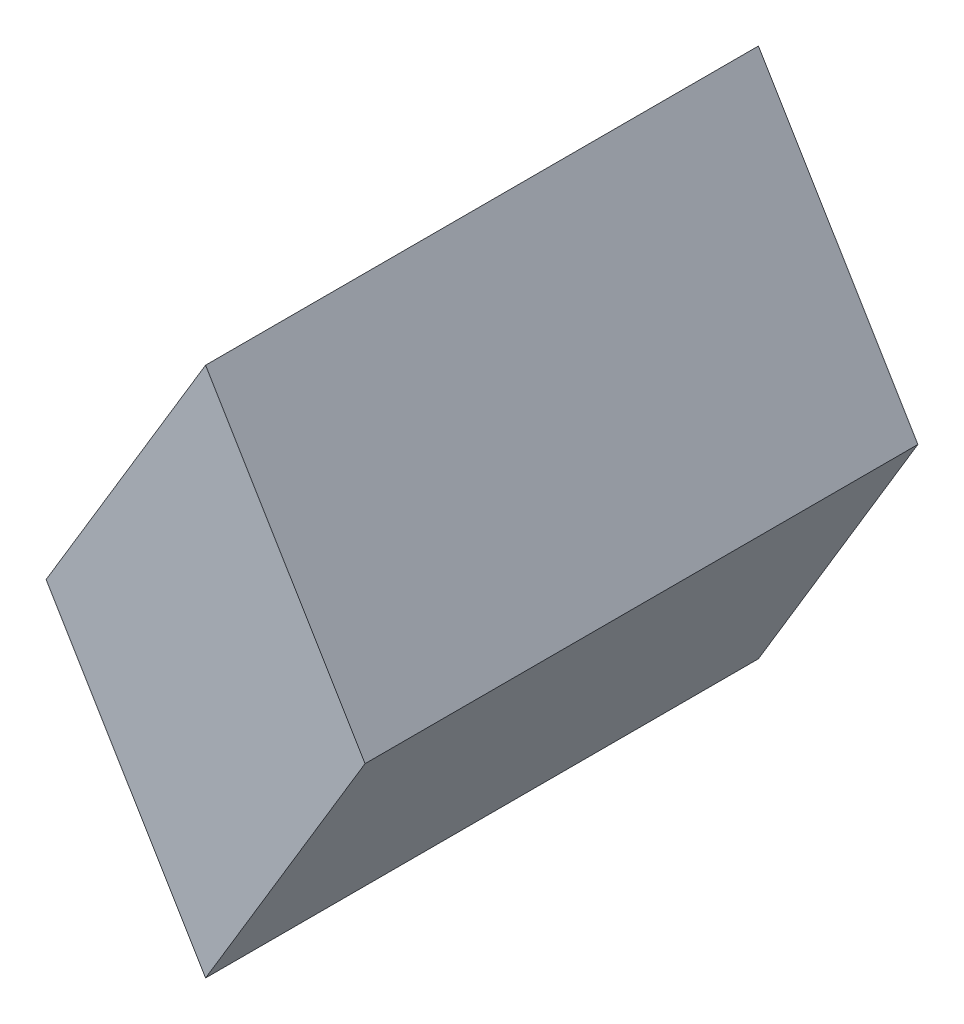
ISO-10303-21;
HEADER;
FILE_DESCRIPTION(('STEP AP214'),'2;1');
FILE_NAME('part.step','',(''),(''),'','','');
FILE_SCHEMA(('AUTOMOTIVE_DESIGN { 1 0 10303 214 1 1 1 1 }'));
ENDSEC;
DATA;
#1=APPLICATION_CONTEXT('core data for automotive mechanical design processes');
#2=APPLICATION_PROTOCOL_DEFINITION('international standard','automotive_design',2000,#1);
#3=PRODUCT_CONTEXT('',#1,'mechanical');
#4=PRODUCT('Part','Part','',(#3));
#5=PRODUCT_RELATED_PRODUCT_CATEGORY('part','',(#4));
#6=PRODUCT_DEFINITION_FORMATION('','',#4);
#7=PRODUCT_DEFINITION_CONTEXT('part definition',#1,'design');
#8=PRODUCT_DEFINITION('design','',#6,#7);
#9=PRODUCT_DEFINITION_SHAPE('','',#8);
#10=(LENGTH_UNIT() NAMED_UNIT(*) SI_UNIT(.MILLI.,.METRE.));
#11=(NAMED_UNIT(*) PLANE_ANGLE_UNIT() SI_UNIT($,.RADIAN.));
#12=(NAMED_UNIT(*) SI_UNIT($,.STERADIAN.) SOLID_ANGLE_UNIT());
#13=UNCERTAINTY_MEASURE_WITH_UNIT(LENGTH_MEASURE(1.E-05),#10,'distance_accuracy_value','');
#14=(GEOMETRIC_REPRESENTATION_CONTEXT(3) GLOBAL_UNCERTAINTY_ASSIGNED_CONTEXT((#13)) GLOBAL_UNIT_ASSIGNED_CONTEXT((#10,
#11,#12)) REPRESENTATION_CONTEXT('',''));
#15=CARTESIAN_POINT('',(0.,0.,0.));
#16=DIRECTION('',(0.,0.,1.));
#17=DIRECTION('',(1.,0.,0.));
#18=AXIS2_PLACEMENT_3D('',#15,#16,#17);
#19=CARTESIAN_POINT('',(-14.422205101856,0.535031847133759,50.));
#20=DIRECTION('',(0.857142857142857,-0.515078753637713,0.));
#21=DIRECTION('',(0.515078753637713,0.857142857142857,0.));
#22=AXIS2_PLACEMENT_3D('',#19,#20,#21);
#23=PLANE('',#22);
#24=DIRECTION('',(-0.515078753637713,-0.857142857142857,0.));
#25=VECTOR('',#24,1.);
#26=CARTESIAN_POINT('',(-14.422205101856,0.535031847133759,0.));
#27=LINE('',#26,#25);
#28=CARTESIAN_POINT('',(0.,24.5350318471338,0.));
#29=VERTEX_POINT('',#28);
#30=CARTESIAN_POINT('',(-14.422205101856,0.535031847133759,0.));
#31=VERTEX_POINT('',#30);
#32=EDGE_CURVE('E96',#29,#31,#27,.T.);
#33=ORIENTED_EDGE('',*,*,#32,.T.);
#34=DIRECTION('',(0.,0.,-1.));
#35=VECTOR('',#34,1.);
#36=CARTESIAN_POINT('',(-14.422205101856,0.535031847133759,50.));
#37=LINE('',#36,#35);
#38=CARTESIAN_POINT('',(-14.422205101856,0.535031847133759,50.));
#39=VERTEX_POINT('',#38);
#40=EDGE_CURVE('E11',#39,#31,#37,.T.);
#41=ORIENTED_EDGE('',*,*,#40,.F.);
#42=DIRECTION('',(-0.515078753637713,-0.857142857142857,0.));
#43=VECTOR('',#42,1.);
#44=CARTESIAN_POINT('',(-14.422205101856,0.535031847133759,50.));
#45=LINE('',#44,#43);
#46=CARTESIAN_POINT('',(0.,24.5350318471338,50.));
#47=VERTEX_POINT('',#46);
#48=EDGE_CURVE('E84',#47,#39,#45,.T.);
#49=ORIENTED_EDGE('',*,*,#48,.F.);
#50=DIRECTION('',(0.,0.,-1.));
#51=VECTOR('',#50,1.);
#52=CARTESIAN_POINT('',(0.,24.5350318471338,50.));
#53=LINE('',#52,#51);
#54=EDGE_CURVE('E92',#47,#29,#53,.T.);
#55=ORIENTED_EDGE('',*,*,#54,.T.);
#56=EDGE_LOOP('',(#33,#41,#49,#55));
#57=FACE_BOUND('',#56,.T.);
#58=ADVANCED_FACE('F33',(#57),#23,.F.);
#59=CARTESIAN_POINT('',(0.,-23.4649681528662,50.));
#60=DIRECTION('',(0.857142857142857,0.515078753637713,0.));
#61=DIRECTION('',(-0.515078753637713,0.857142857142857,0.));
#62=AXIS2_PLACEMENT_3D('',#59,#60,#61);
#63=PLANE('',#62);
#64=DIRECTION('',(0.515078753637713,-0.857142857142857,0.));
#65=VECTOR('',#64,1.);
#66=CARTESIAN_POINT('',(0.,-23.4649681528662,0.));
#67=LINE('',#66,#65);
#68=CARTESIAN_POINT('',(0.,-23.4649681528662,0.));
#69=VERTEX_POINT('',#68);
#70=EDGE_CURVE('E88',#31,#69,#67,.T.);
#71=ORIENTED_EDGE('',*,*,#70,.T.);
#72=DIRECTION('',(0.,0.,-1.));
#73=VECTOR('',#72,1.);
#74=CARTESIAN_POINT('',(0.,-23.4649681528662,50.));
#75=LINE('',#74,#73);
#76=CARTESIAN_POINT('',(0.,-23.4649681528662,50.));
#77=VERTEX_POINT('',#76);
#78=EDGE_CURVE('E41',#77,#69,#75,.T.);
#79=ORIENTED_EDGE('',*,*,#78,.F.);
#80=DIRECTION('',(0.515078753637713,-0.857142857142857,0.));
#81=VECTOR('',#80,1.);
#82=CARTESIAN_POINT('',(0.,-23.4649681528662,50.));
#83=LINE('',#82,#81);
#84=EDGE_CURVE('E79',#39,#77,#83,.T.);
#85=ORIENTED_EDGE('',*,*,#84,.F.);
#86=ORIENTED_EDGE('',*,*,#40,.T.);
#87=EDGE_LOOP('',(#71,#79,#85,#86));
#88=FACE_BOUND('',#87,.T.);
#89=ADVANCED_FACE('F87',(#88),#63,.F.);
#90=CARTESIAN_POINT('',(14.422205101856,0.535031847133759,50.));
#91=DIRECTION('',(-0.857142857142857,0.515078753637713,0.));
#92=DIRECTION('',(-0.515078753637713,-0.857142857142857,0.));
#93=AXIS2_PLACEMENT_3D('',#90,#91,#92);
#94=PLANE('',#93);
#95=DIRECTION('',(0.515078753637713,0.857142857142857,0.));
#96=VECTOR('',#95,1.);
#97=CARTESIAN_POINT('',(14.422205101856,0.535031847133759,0.));
#98=LINE('',#97,#96);
#99=CARTESIAN_POINT('',(14.422205101856,0.535031847133759,0.));
#100=VERTEX_POINT('',#99);
#101=EDGE_CURVE('E66',#69,#100,#98,.T.);
#102=ORIENTED_EDGE('',*,*,#101,.T.);
#103=DIRECTION('',(0.,0.,-1.));
#104=VECTOR('',#103,1.);
#105=CARTESIAN_POINT('',(14.422205101856,0.535031847133759,50.));
#106=LINE('',#105,#104);
#107=CARTESIAN_POINT('',(14.422205101856,0.535031847133759,50.));
#108=VERTEX_POINT('',#107);
#109=EDGE_CURVE('E89',#108,#100,#106,.T.);
#110=ORIENTED_EDGE('',*,*,#109,.F.);
#111=DIRECTION('',(0.515078753637713,0.857142857142857,0.));
#112=VECTOR('',#111,1.);
#113=CARTESIAN_POINT('',(14.422205101856,0.535031847133759,50.));
#114=LINE('',#113,#112);
#115=EDGE_CURVE('E82',#77,#108,#114,.T.);
#116=ORIENTED_EDGE('',*,*,#115,.F.);
#117=ORIENTED_EDGE('',*,*,#78,.T.);
#118=EDGE_LOOP('',(#102,#110,#116,#117));
#119=FACE_BOUND('',#118,.T.);
#120=ADVANCED_FACE('F90',(#119),#94,.F.);
#121=CARTESIAN_POINT('',(0.,24.5350318471338,50.));
#122=DIRECTION('',(-0.857142857142857,-0.515078753637713,0.));
#123=DIRECTION('',(0.515078753637713,-0.857142857142857,0.));
#124=AXIS2_PLACEMENT_3D('',#121,#122,#123);
#125=PLANE('',#124);
#126=DIRECTION('',(-0.515078753637713,0.857142857142857,0.));
#127=VECTOR('',#126,1.);
#128=CARTESIAN_POINT('',(0.,24.5350318471338,0.));
#129=LINE('',#128,#127);
#130=EDGE_CURVE('E72',#100,#29,#129,.T.);
#131=ORIENTED_EDGE('',*,*,#130,.T.);
#132=ORIENTED_EDGE('',*,*,#54,.F.);
#133=DIRECTION('',(-0.515078753637713,0.857142857142857,0.));
#134=VECTOR('',#133,1.);
#135=CARTESIAN_POINT('',(0.,24.5350318471338,50.));
#136=LINE('',#135,#134);
#137=EDGE_CURVE('E49',#108,#47,#136,.T.);
#138=ORIENTED_EDGE('',*,*,#137,.F.);
#139=ORIENTED_EDGE('',*,*,#109,.T.);
#140=EDGE_LOOP('',(#131,#132,#138,#139));
#141=FACE_BOUND('',#140,.T.);
#142=ADVANCED_FACE('F104',(#141),#125,.F.);
#143=CARTESIAN_POINT('',(0.,0.,50.));
#144=DIRECTION('',(0.,0.,-1.));
#145=DIRECTION('',(-1.,0.,0.));
#146=AXIS2_PLACEMENT_3D('',#143,#144,#145);
#147=PLANE('',#146);
#148=ORIENTED_EDGE('',*,*,#48,.T.);
#149=ORIENTED_EDGE('',*,*,#84,.T.);
#150=ORIENTED_EDGE('',*,*,#115,.T.);
#151=ORIENTED_EDGE('',*,*,#137,.T.);
#152=EDGE_LOOP('',(#148,#149,#150,#151));
#153=FACE_BOUND('',#152,.T.);
#154=ADVANCED_FACE('F80',(#153),#147,.F.);
#155=CARTESIAN_POINT('',(0.,0.,0.));
#156=DIRECTION('',(0.,0.,-1.));
#157=DIRECTION('',(-1.,0.,0.));
#158=AXIS2_PLACEMENT_3D('',#155,#156,#157);
#159=PLANE('',#158);
#160=CARTESIAN_POINT('',(0.,0.,0.));
#161=DIRECTION('',(0.,0.,-1.));
#162=DIRECTION('',(-1.,0.,0.));
#163=AXIS2_PLACEMENT_3D('',#160,#161,#162);
#164=CIRCLE('',#163,5.);
#165=CARTESIAN_POINT('',(-5.,0.,0.));
#166=VERTEX_POINT('',#165);
#167=EDGE_CURVE('E110',#166,#166,#164,.T.);
#168=ORIENTED_EDGE('',*,*,#167,.F.);
#169=EDGE_LOOP('',(#168));
#170=FACE_BOUND('',#169,.T.);
#171=ORIENTED_EDGE('',*,*,#32,.F.);
#172=ORIENTED_EDGE('',*,*,#130,.F.);
#173=ORIENTED_EDGE('',*,*,#101,.F.);
#174=ORIENTED_EDGE('',*,*,#70,.F.);
#175=EDGE_LOOP('',(#171,#172,#173,#174));
#176=FACE_BOUND('',#175,.T.);
#177=ADVANCED_FACE('F107',(#170,#176),#159,.T.);
#178=CARTESIAN_POINT('',(0.,0.,10.));
#179=DIRECTION('',(0.,0.,-1.));
#180=DIRECTION('',(-1.,0.,0.));
#181=AXIS2_PLACEMENT_3D('',#178,#179,#180);
#182=CYLINDRICAL_SURFACE('',#181,5.);
#183=CARTESIAN_POINT('',(0.,0.,10.));
#184=DIRECTION('',(0.,0.,-1.));
#185=DIRECTION('',(-1.,0.,0.));
#186=AXIS2_PLACEMENT_3D('',#183,#184,#185);
#187=CIRCLE('',#186,5.);
#188=CARTESIAN_POINT('',(-5.,0.,10.));
#189=VERTEX_POINT('',#188);
#190=EDGE_CURVE('E99',#189,#189,#187,.T.);
#191=ORIENTED_EDGE('',*,*,#190,.F.);
#192=EDGE_LOOP('',(#191));
#193=FACE_BOUND('',#192,.T.);
#194=ORIENTED_EDGE('',*,*,#167,.T.);
#195=EDGE_LOOP('',(#194));
#196=FACE_BOUND('',#195,.T.);
#197=ADVANCED_FACE('F118',(#193,#196),#182,.F.);
#198=CARTESIAN_POINT('',(0.,0.,10.));
#199=DIRECTION('',(0.,0.,-1.));
#200=DIRECTION('',(-1.,0.,0.));
#201=AXIS2_PLACEMENT_3D('',#198,#199,#200);
#202=PLANE('',#201);
#203=ORIENTED_EDGE('',*,*,#190,.T.);
#204=EDGE_LOOP('',(#203));
#205=FACE_BOUND('',#204,.T.);
#206=ADVANCED_FACE('F116',(#205),#202,.T.);
#207=CLOSED_SHELL('',(#58,#89,#120,#142,#154,#177,#197,#206));
#208=MANIFOLD_SOLID_BREP('B2',#207);
#209=ADVANCED_BREP_SHAPE_REPRESENTATION('',(#18,#208),#14);
#210=SHAPE_DEFINITION_REPRESENTATION(#9,#209);
ENDSEC;
END-ISO-10303-21;
